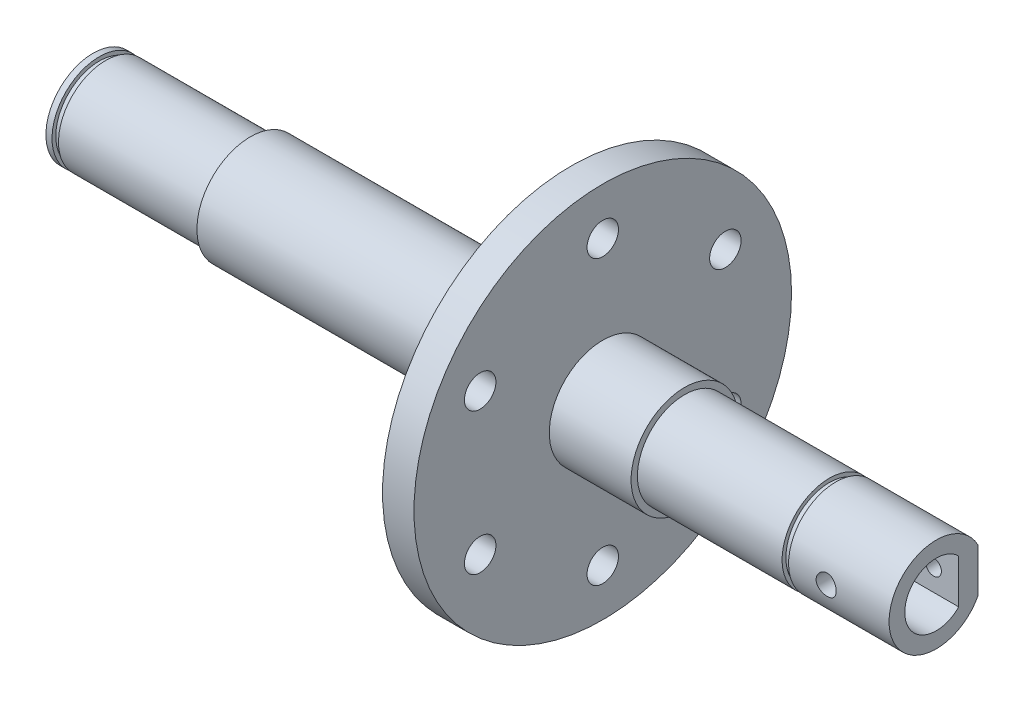
ISO-10303-21;
HEADER;
FILE_DESCRIPTION(('STEP AP214'),'2;1');
FILE_NAME('part.step','',(''),(''),'','','');
FILE_SCHEMA(('AUTOMOTIVE_DESIGN { 1 0 10303 214 1 1 1 1 }'));
ENDSEC;
DATA;
#1=APPLICATION_CONTEXT('core data for automotive mechanical design processes');
#2=APPLICATION_PROTOCOL_DEFINITION('international standard','automotive_design',2000,#1);
#3=PRODUCT_CONTEXT('',#1,'mechanical');
#4=PRODUCT('Part','Part','',(#3));
#5=PRODUCT_RELATED_PRODUCT_CATEGORY('part','',(#4));
#6=PRODUCT_DEFINITION_FORMATION('','',#4);
#7=PRODUCT_DEFINITION_CONTEXT('part definition',#1,'design');
#8=PRODUCT_DEFINITION('design','',#6,#7);
#9=PRODUCT_DEFINITION_SHAPE('','',#8);
#10=(LENGTH_UNIT() NAMED_UNIT(*) SI_UNIT(.MILLI.,.METRE.));
#11=(NAMED_UNIT(*) PLANE_ANGLE_UNIT() SI_UNIT($,.RADIAN.));
#12=(NAMED_UNIT(*) SI_UNIT($,.STERADIAN.) SOLID_ANGLE_UNIT());
#13=UNCERTAINTY_MEASURE_WITH_UNIT(LENGTH_MEASURE(1.E-05),#10,'distance_accuracy_value','');
#14=(GEOMETRIC_REPRESENTATION_CONTEXT(3) GLOBAL_UNCERTAINTY_ASSIGNED_CONTEXT((#13)) GLOBAL_UNIT_ASSIGNED_CONTEXT((#10,
#11,#12)) REPRESENTATION_CONTEXT('',''));
#15=CARTESIAN_POINT('',(0.,0.,0.));
#16=DIRECTION('',(0.,0.,1.));
#17=DIRECTION('',(1.,0.,0.));
#18=AXIS2_PLACEMENT_3D('',#15,#16,#17);
#19=CARTESIAN_POINT('',(0.,0.,0.));
#20=DIRECTION('',(-1.,0.,0.));
#21=DIRECTION('',(0.,0.,-1.));
#22=AXIS2_PLACEMENT_3D('',#19,#20,#21);
#23=CYLINDRICAL_SURFACE('',#22,7.5);
#24=CARTESIAN_POINT('',(94.,0.,0.));
#25=DIRECTION('',(1.,0.,0.));
#26=DIRECTION('',(0.,0.,-1.));
#27=AXIS2_PLACEMENT_3D('',#24,#25,#26);
#28=CIRCLE('',#27,7.5);
#29=CARTESIAN_POINT('',(94.,0.,-7.5));
#30=VERTEX_POINT('',#29);
#31=EDGE_CURVE('E49',#30,#30,#28,.T.);
#32=ORIENTED_EDGE('',*,*,#31,.T.);
#33=EDGE_LOOP('',(#32));
#34=FACE_BOUND('',#33,.T.);
#35=CARTESIAN_POINT('',(117.,0.,0.));
#36=DIRECTION('',(-1.,0.,0.));
#37=DIRECTION('',(0.,1.,0.));
#38=AXIS2_PLACEMENT_3D('',#35,#36,#37);
#39=CIRCLE('',#38,7.5);
#40=CARTESIAN_POINT('',(117.,7.5,0.));
#41=VERTEX_POINT('',#40);
#42=EDGE_CURVE('E576',#41,#41,#39,.T.);
#43=ORIENTED_EDGE('',*,*,#42,.T.);
#44=EDGE_LOOP('',(#43));
#45=FACE_BOUND('',#44,.T.);
#46=ADVANCED_FACE('F41',(#34,#45),#23,.T.);
#47=CARTESIAN_POINT('',(0.,0.,0.));
#48=DIRECTION('',(-1.,0.,0.));
#49=DIRECTION('',(0.,0.,-1.));
#50=AXIS2_PLACEMENT_3D('',#47,#48,#49);
#51=CYLINDRICAL_SURFACE('',#50,7.5);
#52=CARTESIAN_POINT('',(25.,0.,0.));
#53=DIRECTION('',(1.,0.,0.));
#54=DIRECTION('',(0.,0.,-1.));
#55=AXIS2_PLACEMENT_3D('',#52,#53,#54);
#56=CIRCLE('',#55,7.5);
#57=CARTESIAN_POINT('',(25.,0.,-7.5));
#58=VERTEX_POINT('',#57);
#59=EDGE_CURVE('E159',#58,#58,#56,.T.);
#60=ORIENTED_EDGE('',*,*,#59,.F.);
#61=EDGE_LOOP('',(#60));
#62=FACE_BOUND('',#61,.T.);
#63=CARTESIAN_POINT('',(2.,0.,0.));
#64=DIRECTION('',(1.,0.,0.));
#65=DIRECTION('',(0.,-1.,0.));
#66=AXIS2_PLACEMENT_3D('',#63,#64,#65);
#67=CIRCLE('',#66,7.5);
#68=CARTESIAN_POINT('',(2.,-7.5,0.));
#69=VERTEX_POINT('',#68);
#70=EDGE_CURVE('E565',#69,#69,#67,.T.);
#71=ORIENTED_EDGE('',*,*,#70,.T.);
#72=EDGE_LOOP('',(#71));
#73=FACE_BOUND('',#72,.T.);
#74=ADVANCED_FACE('F187',(#62,#73),#51,.T.);
#75=CARTESIAN_POINT('',(94.,8.5,0.));
#76=DIRECTION('',(-1.,0.,0.));
#77=DIRECTION('',(0.,0.,-1.));
#78=AXIS2_PLACEMENT_3D('',#75,#76,#77);
#79=PLANE('',#78);
#80=CARTESIAN_POINT('',(94.,0.,0.));
#81=DIRECTION('',(1.,0.,0.));
#82=DIRECTION('',(0.,0.,-1.));
#83=AXIS2_PLACEMENT_3D('',#80,#81,#82);
#84=CIRCLE('',#83,8.5);
#85=CARTESIAN_POINT('',(94.,0.,-8.5));
#86=VERTEX_POINT('',#85);
#87=EDGE_CURVE('E177',#86,#86,#84,.T.);
#88=ORIENTED_EDGE('',*,*,#87,.T.);
#89=EDGE_LOOP('',(#88));
#90=FACE_BOUND('',#89,.T.);
#91=ORIENTED_EDGE('',*,*,#31,.F.);
#92=EDGE_LOOP('',(#91));
#93=FACE_BOUND('',#92,.T.);
#94=ADVANCED_FACE('F184',(#90,#93),#79,.F.);
#95=CARTESIAN_POINT('',(0.,0.,0.));
#96=DIRECTION('',(-1.,0.,0.));
#97=DIRECTION('',(0.,0.,-1.));
#98=AXIS2_PLACEMENT_3D('',#95,#96,#97);
#99=CYLINDRICAL_SURFACE('',#98,8.5);
#100=CARTESIAN_POINT('',(81.,0.,0.));
#101=DIRECTION('',(1.,0.,0.));
#102=DIRECTION('',(0.,0.,-1.));
#103=AXIS2_PLACEMENT_3D('',#100,#101,#102);
#104=CIRCLE('',#103,8.5);
#105=CARTESIAN_POINT('',(81.,0.,-8.5));
#106=VERTEX_POINT('',#105);
#107=EDGE_CURVE('E174',#106,#106,#104,.T.);
#108=ORIENTED_EDGE('',*,*,#107,.T.);
#109=EDGE_LOOP('',(#108));
#110=FACE_BOUND('',#109,.T.);
#111=ORIENTED_EDGE('',*,*,#87,.F.);
#112=EDGE_LOOP('',(#111));
#113=FACE_BOUND('',#112,.T.);
#114=ADVANCED_FACE('F186',(#110,#113),#99,.T.);
#115=CARTESIAN_POINT('',(81.,8.5,0.));
#116=DIRECTION('',(-1.,0.,0.));
#117=DIRECTION('',(0.,0.,-1.));
#118=AXIS2_PLACEMENT_3D('',#115,#116,#117);
#119=PLANE('',#118);
#120=CARTESIAN_POINT('',(81.,11.2500000000008,-19.4855715851503));
#121=DIRECTION('',(1.,0.,0.));
#122=DIRECTION('',(0.,0.,-1.));
#123=AXIS2_PLACEMENT_3D('',#120,#121,#122);
#124=CIRCLE('',#123,2.50000000000027);
#125=CARTESIAN_POINT('',(81.,11.2500000000008,-21.9855715851506));
#126=VERTEX_POINT('',#125);
#127=EDGE_CURVE('E147',#126,#126,#124,.T.);
#128=ORIENTED_EDGE('',*,*,#127,.F.);
#129=EDGE_LOOP('',(#128));
#130=FACE_BOUND('',#129,.T.);
#131=CARTESIAN_POINT('',(81.,-11.2499999999992,-19.4855715851513));
#132=DIRECTION('',(1.,0.,0.));
#133=DIRECTION('',(0.,0.,-1.));
#134=AXIS2_PLACEMENT_3D('',#131,#132,#133);
#135=CIRCLE('',#134,2.50000000000123);
#136=CARTESIAN_POINT('',(81.,-11.2499999999992,-21.9855715851525));
#137=VERTEX_POINT('',#136);
#138=EDGE_CURVE('E144',#137,#137,#135,.T.);
#139=ORIENTED_EDGE('',*,*,#138,.F.);
#140=EDGE_LOOP('',(#139));
#141=FACE_BOUND('',#140,.T.);
#142=CARTESIAN_POINT('',(81.,-22.5,-1.91295447595611E-12));
#143=DIRECTION('',(1.,0.,0.));
#144=DIRECTION('',(0.,0.,-1.));
#145=AXIS2_PLACEMENT_3D('',#142,#143,#144);
#146=CIRCLE('',#145,2.50000000000198);
#147=CARTESIAN_POINT('',(81.,-22.5,-2.50000000000389));
#148=VERTEX_POINT('',#147);
#149=EDGE_CURVE('E141',#148,#148,#146,.T.);
#150=ORIENTED_EDGE('',*,*,#149,.F.);
#151=EDGE_LOOP('',(#150));
#152=FACE_BOUND('',#151,.T.);
#153=CARTESIAN_POINT('',(81.,-11.2500000000008,19.4855715851484));
#154=DIRECTION('',(1.,0.,0.));
#155=DIRECTION('',(0.,0.,-1.));
#156=AXIS2_PLACEMENT_3D('',#153,#154,#155);
#157=CIRCLE('',#156,2.50000000000183);
#158=CARTESIAN_POINT('',(81.,-11.2500000000008,16.9855715851466));
#159=VERTEX_POINT('',#158);
#160=EDGE_CURVE('E138',#159,#159,#157,.T.);
#161=ORIENTED_EDGE('',*,*,#160,.F.);
#162=EDGE_LOOP('',(#161));
#163=FACE_BOUND('',#162,.T.);
#164=CARTESIAN_POINT('',(81.,11.2499999999992,19.4855715851494));
#165=DIRECTION('',(1.,0.,0.));
#166=DIRECTION('',(0.,0.,-1.));
#167=AXIS2_PLACEMENT_3D('',#164,#165,#166);
#168=CIRCLE('',#167,2.50000000000097);
#169=CARTESIAN_POINT('',(81.,11.2499999999992,16.9855715851484));
#170=VERTEX_POINT('',#169);
#171=EDGE_CURVE('E124',#170,#170,#168,.T.);
#172=ORIENTED_EDGE('',*,*,#171,.F.);
#173=EDGE_LOOP('',(#172));
#174=FACE_BOUND('',#173,.T.);
#175=CARTESIAN_POINT('',(81.,22.5,0.));
#176=DIRECTION('',(1.,0.,0.));
#177=DIRECTION('',(0.,0.,-1.));
#178=AXIS2_PLACEMENT_3D('',#175,#176,#177);
#179=CIRCLE('',#178,2.5);
#180=CARTESIAN_POINT('',(81.,22.5,-2.5));
#181=VERTEX_POINT('',#180);
#182=EDGE_CURVE('E153',#181,#181,#179,.T.);
#183=ORIENTED_EDGE('',*,*,#182,.F.);
#184=EDGE_LOOP('',(#183));
#185=FACE_BOUND('',#184,.T.);
#186=CARTESIAN_POINT('',(81.,0.,0.));
#187=DIRECTION('',(1.,0.,0.));
#188=DIRECTION('',(0.,0.,-1.));
#189=AXIS2_PLACEMENT_3D('',#186,#187,#188);
#190=CIRCLE('',#189,30.);
#191=CARTESIAN_POINT('',(81.,0.,-30.));
#192=VERTEX_POINT('',#191);
#193=EDGE_CURVE('E171',#192,#192,#190,.T.);
#194=ORIENTED_EDGE('',*,*,#193,.T.);
#195=EDGE_LOOP('',(#194));
#196=FACE_BOUND('',#195,.T.);
#197=ORIENTED_EDGE('',*,*,#107,.F.);
#198=EDGE_LOOP('',(#197));
#199=FACE_BOUND('',#198,.T.);
#200=ADVANCED_FACE('F194',(#130,#141,#152,#163,#174,#185,#196,#199),#119,.F.);
#201=CARTESIAN_POINT('',(0.,0.,0.));
#202=DIRECTION('',(-1.,0.,0.));
#203=DIRECTION('',(0.,0.,-1.));
#204=AXIS2_PLACEMENT_3D('',#201,#202,#203);
#205=CYLINDRICAL_SURFACE('',#204,30.);
#206=CARTESIAN_POINT('',(76.,0.,0.));
#207=DIRECTION('',(1.,0.,0.));
#208=DIRECTION('',(0.,0.,-1.));
#209=AXIS2_PLACEMENT_3D('',#206,#207,#208);
#210=CIRCLE('',#209,30.);
#211=CARTESIAN_POINT('',(76.,0.,-30.));
#212=VERTEX_POINT('',#211);
#213=EDGE_CURVE('E168',#212,#212,#210,.T.);
#214=ORIENTED_EDGE('',*,*,#213,.T.);
#215=EDGE_LOOP('',(#214));
#216=FACE_BOUND('',#215,.T.);
#217=ORIENTED_EDGE('',*,*,#193,.F.);
#218=EDGE_LOOP('',(#217));
#219=FACE_BOUND('',#218,.T.);
#220=ADVANCED_FACE('F281',(#216,#219),#205,.T.);
#221=CARTESIAN_POINT('',(76.,30.,0.));
#222=DIRECTION('',(1.,0.,0.));
#223=DIRECTION('',(0.,0.,1.));
#224=AXIS2_PLACEMENT_3D('',#221,#222,#223);
#225=PLANE('',#224);
#226=CARTESIAN_POINT('',(76.,11.2500000000008,-19.4855715851503));
#227=DIRECTION('',(1.,0.,0.));
#228=DIRECTION('',(0.,-1.,0.));
#229=AXIS2_PLACEMENT_3D('',#226,#227,#228);
#230=CIRCLE('',#229,2.50000000000027);
#231=CARTESIAN_POINT('',(76.,8.75000000000056,-19.4855715851503));
#232=VERTEX_POINT('',#231);
#233=EDGE_CURVE('E121',#232,#232,#230,.T.);
#234=ORIENTED_EDGE('',*,*,#233,.T.);
#235=EDGE_LOOP('',(#234));
#236=FACE_BOUND('',#235,.T.);
#237=CARTESIAN_POINT('',(76.,-11.2499999999992,-19.4855715851513));
#238=DIRECTION('',(1.,0.,0.));
#239=DIRECTION('',(0.,-1.,0.));
#240=AXIS2_PLACEMENT_3D('',#237,#238,#239);
#241=CIRCLE('',#240,2.50000000000123);
#242=CARTESIAN_POINT('',(76.,-13.7500000000004,-19.4855715851513));
#243=VERTEX_POINT('',#242);
#244=EDGE_CURVE('E125',#243,#243,#241,.T.);
#245=ORIENTED_EDGE('',*,*,#244,.T.);
#246=EDGE_LOOP('',(#245));
#247=FACE_BOUND('',#246,.T.);
#248=CARTESIAN_POINT('',(76.,-22.5,-1.91295447595611E-12));
#249=DIRECTION('',(1.,0.,0.));
#250=DIRECTION('',(0.,-1.,0.));
#251=AXIS2_PLACEMENT_3D('',#248,#249,#250);
#252=CIRCLE('',#251,2.50000000000198);
#253=CARTESIAN_POINT('',(76.,-25.000000000002,-1.91295447595611E-12));
#254=VERTEX_POINT('',#253);
#255=EDGE_CURVE('E128',#254,#254,#252,.T.);
#256=ORIENTED_EDGE('',*,*,#255,.T.);
#257=EDGE_LOOP('',(#256));
#258=FACE_BOUND('',#257,.T.);
#259=CARTESIAN_POINT('',(76.,-11.2500000000008,19.4855715851484));
#260=DIRECTION('',(1.,0.,0.));
#261=DIRECTION('',(0.,-1.,0.));
#262=AXIS2_PLACEMENT_3D('',#259,#260,#261);
#263=CIRCLE('',#262,2.50000000000183);
#264=CARTESIAN_POINT('',(76.,-13.7500000000027,19.4855715851484));
#265=VERTEX_POINT('',#264);
#266=EDGE_CURVE('E131',#265,#265,#263,.T.);
#267=ORIENTED_EDGE('',*,*,#266,.T.);
#268=EDGE_LOOP('',(#267));
#269=FACE_BOUND('',#268,.T.);
#270=CARTESIAN_POINT('',(76.,11.2499999999992,19.4855715851494));
#271=DIRECTION('',(1.,0.,0.));
#272=DIRECTION('',(0.,-1.,0.));
#273=AXIS2_PLACEMENT_3D('',#270,#271,#272);
#274=CIRCLE('',#273,2.50000000000097);
#275=CARTESIAN_POINT('',(76.,8.74999999999819,19.4855715851494));
#276=VERTEX_POINT('',#275);
#277=EDGE_CURVE('E119',#276,#276,#274,.T.);
#278=ORIENTED_EDGE('',*,*,#277,.T.);
#279=EDGE_LOOP('',(#278));
#280=FACE_BOUND('',#279,.T.);
#281=CARTESIAN_POINT('',(76.,22.5,0.));
#282=DIRECTION('',(1.,0.,0.));
#283=DIRECTION('',(0.,-1.,0.));
#284=AXIS2_PLACEMENT_3D('',#281,#282,#283);
#285=CIRCLE('',#284,2.5);
#286=CARTESIAN_POINT('',(76.,20.,0.));
#287=VERTEX_POINT('',#286);
#288=EDGE_CURVE('E150',#287,#287,#285,.T.);
#289=ORIENTED_EDGE('',*,*,#288,.T.);
#290=EDGE_LOOP('',(#289));
#291=FACE_BOUND('',#290,.T.);
#292=CARTESIAN_POINT('',(76.,0.,0.));
#293=DIRECTION('',(1.,0.,0.));
#294=DIRECTION('',(0.,0.,-1.));
#295=AXIS2_PLACEMENT_3D('',#292,#293,#294);
#296=CIRCLE('',#295,8.5);
#297=CARTESIAN_POINT('',(76.,0.,-8.5));
#298=VERTEX_POINT('',#297);
#299=EDGE_CURVE('E165',#298,#298,#296,.T.);
#300=ORIENTED_EDGE('',*,*,#299,.T.);
#301=EDGE_LOOP('',(#300));
#302=FACE_BOUND('',#301,.T.);
#303=ORIENTED_EDGE('',*,*,#213,.F.);
#304=EDGE_LOOP('',(#303));
#305=FACE_BOUND('',#304,.T.);
#306=ADVANCED_FACE('F277',(#236,#247,#258,#269,#280,#291,#302,#305),#225,.F.);
#307=CARTESIAN_POINT('',(0.,0.,0.));
#308=DIRECTION('',(-1.,0.,0.));
#309=DIRECTION('',(0.,0.,-1.));
#310=AXIS2_PLACEMENT_3D('',#307,#308,#309);
#311=CYLINDRICAL_SURFACE('',#310,8.5);
#312=CARTESIAN_POINT('',(25.,0.,0.));
#313=DIRECTION('',(1.,0.,0.));
#314=DIRECTION('',(0.,0.,-1.));
#315=AXIS2_PLACEMENT_3D('',#312,#313,#314);
#316=CIRCLE('',#315,8.49999999999999);
#317=CARTESIAN_POINT('',(25.,0.,-8.49999999999999));
#318=VERTEX_POINT('',#317);
#319=EDGE_CURVE('E162',#318,#318,#316,.T.);
#320=ORIENTED_EDGE('',*,*,#319,.T.);
#321=EDGE_LOOP('',(#320));
#322=FACE_BOUND('',#321,.T.);
#323=ORIENTED_EDGE('',*,*,#299,.F.);
#324=EDGE_LOOP('',(#323));
#325=FACE_BOUND('',#324,.T.);
#326=ADVANCED_FACE('F273',(#322,#325),#311,.T.);
#327=CARTESIAN_POINT('',(25.,8.49999999999999,0.));
#328=DIRECTION('',(1.,0.,0.));
#329=DIRECTION('',(0.,0.,1.));
#330=AXIS2_PLACEMENT_3D('',#327,#328,#329);
#331=PLANE('',#330);
#332=ORIENTED_EDGE('',*,*,#59,.T.);
#333=EDGE_LOOP('',(#332));
#334=FACE_BOUND('',#333,.T.);
#335=ORIENTED_EDGE('',*,*,#319,.F.);
#336=EDGE_LOOP('',(#335));
#337=FACE_BOUND('',#336,.T.);
#338=ADVANCED_FACE('F265',(#334,#337),#331,.F.);
#339=CARTESIAN_POINT('',(134.,22.5,0.));
#340=DIRECTION('',(-1.,0.,0.));
#341=DIRECTION('',(0.,-1.,0.));
#342=AXIS2_PLACEMENT_3D('',#339,#340,#341);
#343=CYLINDRICAL_SURFACE('',#342,2.5);
#344=ORIENTED_EDGE('',*,*,#288,.F.);
#345=EDGE_LOOP('',(#344));
#346=FACE_BOUND('',#345,.T.);
#347=ORIENTED_EDGE('',*,*,#182,.T.);
#348=EDGE_LOOP('',(#347));
#349=FACE_BOUND('',#348,.T.);
#350=ADVANCED_FACE('F262',(#346,#349),#343,.F.);
#351=CARTESIAN_POINT('',(134.,11.2499999999992,19.4855715851494));
#352=DIRECTION('',(-1.,0.,0.));
#353=DIRECTION('',(0.,-1.,0.));
#354=AXIS2_PLACEMENT_3D('',#351,#352,#353);
#355=CYLINDRICAL_SURFACE('',#354,2.50000000000097);
#356=ORIENTED_EDGE('',*,*,#277,.F.);
#357=EDGE_LOOP('',(#356));
#358=FACE_BOUND('',#357,.T.);
#359=ORIENTED_EDGE('',*,*,#171,.T.);
#360=EDGE_LOOP('',(#359));
#361=FACE_BOUND('',#360,.T.);
#362=ADVANCED_FACE('F258',(#358,#361),#355,.F.);
#363=CARTESIAN_POINT('',(134.,-11.2500000000008,19.4855715851484));
#364=DIRECTION('',(-1.,0.,0.));
#365=DIRECTION('',(0.,-1.,0.));
#366=AXIS2_PLACEMENT_3D('',#363,#364,#365);
#367=CYLINDRICAL_SURFACE('',#366,2.50000000000183);
#368=ORIENTED_EDGE('',*,*,#266,.F.);
#369=EDGE_LOOP('',(#368));
#370=FACE_BOUND('',#369,.T.);
#371=ORIENTED_EDGE('',*,*,#160,.T.);
#372=EDGE_LOOP('',(#371));
#373=FACE_BOUND('',#372,.T.);
#374=ADVANCED_FACE('F254',(#370,#373),#367,.F.);
#375=CARTESIAN_POINT('',(134.,-22.5,-1.91295447595611E-12));
#376=DIRECTION('',(-1.,0.,0.));
#377=DIRECTION('',(0.,-1.,0.));
#378=AXIS2_PLACEMENT_3D('',#375,#376,#377);
#379=CYLINDRICAL_SURFACE('',#378,2.50000000000198);
#380=ORIENTED_EDGE('',*,*,#255,.F.);
#381=EDGE_LOOP('',(#380));
#382=FACE_BOUND('',#381,.T.);
#383=ORIENTED_EDGE('',*,*,#149,.T.);
#384=EDGE_LOOP('',(#383));
#385=FACE_BOUND('',#384,.T.);
#386=ADVANCED_FACE('F250',(#382,#385),#379,.F.);
#387=CARTESIAN_POINT('',(134.,-11.2499999999992,-19.4855715851513));
#388=DIRECTION('',(-1.,0.,0.));
#389=DIRECTION('',(0.,-1.,0.));
#390=AXIS2_PLACEMENT_3D('',#387,#388,#389);
#391=CYLINDRICAL_SURFACE('',#390,2.50000000000123);
#392=ORIENTED_EDGE('',*,*,#244,.F.);
#393=EDGE_LOOP('',(#392));
#394=FACE_BOUND('',#393,.T.);
#395=ORIENTED_EDGE('',*,*,#138,.T.);
#396=EDGE_LOOP('',(#395));
#397=FACE_BOUND('',#396,.T.);
#398=ADVANCED_FACE('F246',(#394,#397),#391,.F.);
#399=CARTESIAN_POINT('',(134.,11.2500000000008,-19.4855715851503));
#400=DIRECTION('',(-1.,0.,0.));
#401=DIRECTION('',(0.,-1.,0.));
#402=AXIS2_PLACEMENT_3D('',#399,#400,#401);
#403=CYLINDRICAL_SURFACE('',#402,2.50000000000027);
#404=ORIENTED_EDGE('',*,*,#233,.F.);
#405=EDGE_LOOP('',(#404));
#406=FACE_BOUND('',#405,.T.);
#407=ORIENTED_EDGE('',*,*,#127,.T.);
#408=EDGE_LOOP('',(#407));
#409=FACE_BOUND('',#408,.T.);
#410=ADVANCED_FACE('F242',(#406,#409),#403,.F.);
#411=CARTESIAN_POINT('',(0.97,0.,0.));
#412=DIRECTION('',(-1.,0.,0.));
#413=DIRECTION('',(0.,-1.,0.));
#414=AXIS2_PLACEMENT_3D('',#411,#412,#413);
#415=PLANE('',#414);
#416=CARTESIAN_POINT('',(0.97,0.,0.));
#417=DIRECTION('',(1.,0.,0.));
#418=DIRECTION('',(0.,-1.,0.));
#419=AXIS2_PLACEMENT_3D('',#416,#417,#418);
#420=CIRCLE('',#419,7.5);
#421=CARTESIAN_POINT('',(0.97,-7.5,0.));
#422=VERTEX_POINT('',#421);
#423=EDGE_CURVE('E564',#422,#422,#420,.T.);
#424=ORIENTED_EDGE('',*,*,#423,.T.);
#425=EDGE_LOOP('',(#424));
#426=FACE_BOUND('',#425,.T.);
#427=CARTESIAN_POINT('',(0.97,0.,0.));
#428=DIRECTION('',(1.,0.,0.));
#429=DIRECTION('',(0.,-1.,0.));
#430=AXIS2_PLACEMENT_3D('',#427,#428,#429);
#431=CIRCLE('',#430,6.9);
#432=CARTESIAN_POINT('',(0.97,-6.9,0.));
#433=VERTEX_POINT('',#432);
#434=EDGE_CURVE('E568',#433,#433,#431,.T.);
#435=ORIENTED_EDGE('',*,*,#434,.F.);
#436=EDGE_LOOP('',(#435));
#437=FACE_BOUND('',#436,.T.);
#438=ADVANCED_FACE('F245',(#426,#437),#415,.F.);
#439=CARTESIAN_POINT('',(2.,0.,0.));
#440=DIRECTION('',(-1.,0.,0.));
#441=DIRECTION('',(0.,-1.,0.));
#442=AXIS2_PLACEMENT_3D('',#439,#440,#441);
#443=PLANE('',#442);
#444=ORIENTED_EDGE('',*,*,#70,.F.);
#445=EDGE_LOOP('',(#444));
#446=FACE_BOUND('',#445,.T.);
#447=CARTESIAN_POINT('',(2.,0.,0.));
#448=DIRECTION('',(1.,0.,0.));
#449=DIRECTION('',(0.,-1.,0.));
#450=AXIS2_PLACEMENT_3D('',#447,#448,#449);
#451=CIRCLE('',#450,6.9);
#452=CARTESIAN_POINT('',(2.,-6.9,0.));
#453=VERTEX_POINT('',#452);
#454=EDGE_CURVE('E571',#453,#453,#451,.T.);
#455=ORIENTED_EDGE('',*,*,#454,.T.);
#456=EDGE_LOOP('',(#455));
#457=FACE_BOUND('',#456,.T.);
#458=ADVANCED_FACE('F362',(#446,#457),#443,.T.);
#459=CARTESIAN_POINT('',(0.97,0.,0.));
#460=DIRECTION('',(1.,0.,0.));
#461=DIRECTION('',(0.,1.,0.));
#462=AXIS2_PLACEMENT_3D('',#459,#460,#461);
#463=CYLINDRICAL_SURFACE('',#462,6.9);
#464=ORIENTED_EDGE('',*,*,#434,.T.);
#465=EDGE_LOOP('',(#464));
#466=FACE_BOUND('',#465,.T.);
#467=ORIENTED_EDGE('',*,*,#454,.F.);
#468=EDGE_LOOP('',(#467));
#469=FACE_BOUND('',#468,.T.);
#470=ADVANCED_FACE('F370',(#466,#469),#463,.T.);
#471=CARTESIAN_POINT('',(0.,7.5,0.));
#472=DIRECTION('',(1.,0.,0.));
#473=DIRECTION('',(0.,0.,1.));
#474=AXIS2_PLACEMENT_3D('',#471,#472,#473);
#475=PLANE('',#474);
#476=CARTESIAN_POINT('',(0.,0.,0.));
#477=DIRECTION('',(1.,0.,0.));
#478=DIRECTION('',(0.,0.,-1.));
#479=AXIS2_PLACEMENT_3D('',#476,#477,#478);
#480=CIRCLE('',#479,7.5);
#481=CARTESIAN_POINT('',(0.,0.,-7.5));
#482=VERTEX_POINT('',#481);
#483=EDGE_CURVE('E156',#482,#482,#480,.T.);
#484=ORIENTED_EDGE('',*,*,#483,.F.);
#485=EDGE_LOOP('',(#484));
#486=FACE_BOUND('',#485,.T.);
#487=ADVANCED_FACE('F43',(#486),#475,.F.);
#488=ORIENTED_EDGE('',*,*,#423,.F.);
#489=EDGE_LOOP('',(#488));
#490=FACE_BOUND('',#489,.T.);
#491=ORIENTED_EDGE('',*,*,#483,.T.);
#492=EDGE_LOOP('',(#491));
#493=FACE_BOUND('',#492,.T.);
#494=ADVANCED_FACE('F199',(#490,#493),#51,.T.);
#495=CARTESIAN_POINT('',(118.03,0.,0.));
#496=DIRECTION('',(1.,0.,0.));
#497=DIRECTION('',(0.,1.,0.));
#498=AXIS2_PLACEMENT_3D('',#495,#496,#497);
#499=PLANE('',#498);
#500=CARTESIAN_POINT('',(118.03,0.,0.));
#501=DIRECTION('',(-1.,0.,0.));
#502=DIRECTION('',(0.,1.,0.));
#503=AXIS2_PLACEMENT_3D('',#500,#501,#502);
#504=CIRCLE('',#503,7.5);
#505=CARTESIAN_POINT('',(118.03,7.5,0.));
#506=VERTEX_POINT('',#505);
#507=EDGE_CURVE('E216',#506,#506,#504,.T.);
#508=ORIENTED_EDGE('',*,*,#507,.T.);
#509=EDGE_LOOP('',(#508));
#510=FACE_BOUND('',#509,.T.);
#511=CARTESIAN_POINT('',(118.03,0.,0.));
#512=DIRECTION('',(-1.,0.,0.));
#513=DIRECTION('',(0.,1.,0.));
#514=AXIS2_PLACEMENT_3D('',#511,#512,#513);
#515=CIRCLE('',#514,6.9);
#516=CARTESIAN_POINT('',(118.03,6.9,0.));
#517=VERTEX_POINT('',#516);
#518=EDGE_CURVE('E579',#517,#517,#515,.T.);
#519=ORIENTED_EDGE('',*,*,#518,.F.);
#520=EDGE_LOOP('',(#519));
#521=FACE_BOUND('',#520,.T.);
#522=ADVANCED_FACE('F269',(#510,#521),#499,.F.);
#523=CARTESIAN_POINT('',(117.,0.,0.));
#524=DIRECTION('',(1.,0.,0.));
#525=DIRECTION('',(0.,1.,0.));
#526=AXIS2_PLACEMENT_3D('',#523,#524,#525);
#527=PLANE('',#526);
#528=ORIENTED_EDGE('',*,*,#42,.F.);
#529=EDGE_LOOP('',(#528));
#530=FACE_BOUND('',#529,.T.);
#531=CARTESIAN_POINT('',(117.,0.,0.));
#532=DIRECTION('',(-1.,0.,0.));
#533=DIRECTION('',(0.,1.,0.));
#534=AXIS2_PLACEMENT_3D('',#531,#532,#533);
#535=CIRCLE('',#534,6.9);
#536=CARTESIAN_POINT('',(117.,6.9,0.));
#537=VERTEX_POINT('',#536);
#538=EDGE_CURVE('E581',#537,#537,#535,.T.);
#539=ORIENTED_EDGE('',*,*,#538,.T.);
#540=EDGE_LOOP('',(#539));
#541=FACE_BOUND('',#540,.T.);
#542=ADVANCED_FACE('F395',(#530,#541),#527,.T.);
#543=CARTESIAN_POINT('',(118.03,0.,0.));
#544=DIRECTION('',(-1.,0.,0.));
#545=DIRECTION('',(0.,-1.,0.));
#546=AXIS2_PLACEMENT_3D('',#543,#544,#545);
#547=CYLINDRICAL_SURFACE('',#546,6.9);
#548=ORIENTED_EDGE('',*,*,#518,.T.);
#549=EDGE_LOOP('',(#548));
#550=FACE_BOUND('',#549,.T.);
#551=ORIENTED_EDGE('',*,*,#538,.F.);
#552=EDGE_LOOP('',(#551));
#553=FACE_BOUND('',#552,.T.);
#554=ADVANCED_FACE('F403',(#550,#553),#547,.T.);
#555=CARTESIAN_POINT('',(120.,0.,0.));
#556=DIRECTION('',(1.,0.,0.));
#557=DIRECTION('',(0.,1.,0.));
#558=AXIS2_PLACEMENT_3D('',#555,#556,#557);
#559=PLANE('',#558);
#560=CARTESIAN_POINT('',(120.,0.,0.));
#561=DIRECTION('',(-1.,0.,0.));
#562=DIRECTION('',(0.,1.,0.));
#563=AXIS2_PLACEMENT_3D('',#560,#561,#562);
#564=CIRCLE('',#563,5.);
#565=CARTESIAN_POINT('',(120.,-3.5,-3.57071421427143));
#566=VERTEX_POINT('',#565);
#567=CARTESIAN_POINT('',(120.,3.5,-3.57071421427143));
#568=VERTEX_POINT('',#567);
#569=EDGE_CURVE('E106',#566,#568,#564,.T.);
#570=ORIENTED_EDGE('',*,*,#569,.F.);
#571=DIRECTION('',(0.,-1.,0.));
#572=VECTOR('',#571,1.);
#573=CARTESIAN_POINT('',(120.,3.5,-3.57071421427143));
#574=LINE('',#573,#572);
#575=EDGE_CURVE('E109',#568,#566,#574,.T.);
#576=ORIENTED_EDGE('',*,*,#575,.F.);
#577=EDGE_LOOP('',(#570,#576));
#578=FACE_BOUND('',#577,.T.);
#579=ADVANCED_FACE('F411',(#578),#559,.T.);
#580=CARTESIAN_POINT('',(124.,0.,30.));
#581=DIRECTION('',(0.,0.,-1.));
#582=DIRECTION('',(1.,0.,0.));
#583=AXIS2_PLACEMENT_3D('',#580,#581,#582);
#584=CYLINDRICAL_SURFACE('',#583,1.60000000000002);
#585=CARTESIAN_POINT('',(124.,0.,-6.6332495807108));
#586=DIRECTION('',(0.,0.,1.));
#587=DIRECTION('',(1.,0.,0.));
#588=AXIS2_PLACEMENT_3D('',#585,#586,#587);
#589=CIRCLE('',#588,1.60000000000002);
#590=CARTESIAN_POINT('',(125.6,0.,-6.6332495807108));
#591=VERTEX_POINT('',#590);
#592=EDGE_CURVE('E225',#591,#591,#589,.T.);
#593=ORIENTED_EDGE('',*,*,#592,.F.);
#594=EDGE_LOOP('',(#593));
#595=FACE_BOUND('',#594,.T.);
#596=CARTESIAN_POINT('',(124.,0.,-3.57071421427142));
#597=DIRECTION('',(0.,0.,1.));
#598=DIRECTION('',(1.,0.,0.));
#599=AXIS2_PLACEMENT_3D('',#596,#597,#598);
#600=CIRCLE('',#599,1.60000000000002);
#601=CARTESIAN_POINT('',(125.6,0.,-3.57071421427142));
#602=VERTEX_POINT('',#601);
#603=EDGE_CURVE('E222',#602,#602,#600,.T.);
#604=ORIENTED_EDGE('',*,*,#603,.T.);
#605=EDGE_LOOP('',(#604));
#606=FACE_BOUND('',#605,.T.);
#607=ADVANCED_FACE('F212',(#595,#606),#584,.F.);
#608=CARTESIAN_POINT('',(130.,0.,-6.6332495807108));
#609=DIRECTION('',(0.,0.,-1.));
#610=DIRECTION('',(1.,0.,0.));
#611=AXIS2_PLACEMENT_3D('',#608,#609,#610);
#612=CYLINDRICAL_SURFACE('',#611,1.25);
#613=CARTESIAN_POINT('',(130.,0.,-6.6332495807108));
#614=DIRECTION('',(0.,0.,1.));
#615=DIRECTION('',(1.,0.,0.));
#616=AXIS2_PLACEMENT_3D('',#613,#614,#615);
#617=CIRCLE('',#616,1.25);
#618=CARTESIAN_POINT('',(131.25,0.,-6.6332495807108));
#619=VERTEX_POINT('',#618);
#620=EDGE_CURVE('E556',#619,#619,#617,.T.);
#621=ORIENTED_EDGE('',*,*,#620,.F.);
#622=EDGE_LOOP('',(#621));
#623=FACE_BOUND('',#622,.T.);
#624=CARTESIAN_POINT('',(130.,0.,-3.57071421427143));
#625=DIRECTION('',(0.,0.,1.));
#626=DIRECTION('',(1.,0.,0.));
#627=AXIS2_PLACEMENT_3D('',#624,#625,#626);
#628=CIRCLE('',#627,1.25);
#629=CARTESIAN_POINT('',(131.25,0.,-3.57071421427143));
#630=VERTEX_POINT('',#629);
#631=EDGE_CURVE('E559',#630,#630,#628,.T.);
#632=ORIENTED_EDGE('',*,*,#631,.T.);
#633=EDGE_LOOP('',(#632));
#634=FACE_BOUND('',#633,.T.);
#635=ADVANCED_FACE('F425',(#623,#634),#612,.F.);
#636=CARTESIAN_POINT('',(120.,3.5,-3.57071421427143));
#637=DIRECTION('',(0.,0.,-1.));
#638=DIRECTION('',(1.,0.,0.));
#639=AXIS2_PLACEMENT_3D('',#636,#637,#638);
#640=PLANE('',#639);
#641=ORIENTED_EDGE('',*,*,#631,.F.);
#642=EDGE_LOOP('',(#641));
#643=FACE_BOUND('',#642,.T.);
#644=ORIENTED_EDGE('',*,*,#603,.F.);
#645=EDGE_LOOP('',(#644));
#646=FACE_BOUND('',#645,.T.);
#647=DIRECTION('',(0.,-1.,0.));
#648=VECTOR('',#647,1.);
#649=CARTESIAN_POINT('',(134.,3.5,-3.57071421427143));
#650=LINE('',#649,#648);
#651=CARTESIAN_POINT('',(134.,3.5,-3.57071421427143));
#652=VERTEX_POINT('',#651);
#653=CARTESIAN_POINT('',(134.,-3.5,-3.57071421427143));
#654=VERTEX_POINT('',#653);
#655=EDGE_CURVE('E110',#652,#654,#650,.T.);
#656=ORIENTED_EDGE('',*,*,#655,.F.);
#657=DIRECTION('',(1.,0.,0.));
#658=VECTOR('',#657,1.);
#659=CARTESIAN_POINT('',(120.,3.5,-3.57071421427143));
#660=LINE('',#659,#658);
#661=EDGE_CURVE('E113',#568,#652,#660,.T.);
#662=ORIENTED_EDGE('',*,*,#661,.F.);
#663=ORIENTED_EDGE('',*,*,#575,.T.);
#664=DIRECTION('',(1.,0.,0.));
#665=VECTOR('',#664,1.);
#666=CARTESIAN_POINT('',(120.,-3.5,-3.57071421427143));
#667=LINE('',#666,#665);
#668=EDGE_CURVE('E116',#566,#654,#667,.T.);
#669=ORIENTED_EDGE('',*,*,#668,.T.);
#670=EDGE_LOOP('',(#656,#662,#663,#669));
#671=FACE_BOUND('',#670,.T.);
#672=ADVANCED_FACE('F239',(#643,#646,#671),#640,.F.);
#673=CARTESIAN_POINT('',(120.,0.,0.));
#674=DIRECTION('',(1.,0.,0.));
#675=DIRECTION('',(0.,1.,0.));
#676=AXIS2_PLACEMENT_3D('',#673,#674,#675);
#677=CYLINDRICAL_SURFACE('',#676,5.);
#678=CARTESIAN_POINT('',(125.6,0.,5.));
#679=CARTESIAN_POINT('',(125.599999756349,-0.0874958063159813,4.99999978543627));
#680=CARTESIAN_POINT('',(125.592799404721,-0.174994637059064,4.99768184156355));
#681=CARTESIAN_POINT('',(125.564268180471,-0.347426901237488,4.98866262172227));
#682=CARTESIAN_POINT('',(125.542934728182,-0.432359863373714,4.98196054553558));
#683=CARTESIAN_POINT('',(125.486935078788,-0.597149225791573,4.9649038363541));
#684=CARTESIAN_POINT('',(125.452290107629,-0.677013473384605,4.95455502045191));
#685=CARTESIAN_POINT('',(125.370743169913,-0.829798762851168,4.93126901642872));
#686=CARTESIAN_POINT('',(125.323839094234,-0.902718607024957,4.91833138300385));
#687=CARTESIAN_POINT('',(125.217515886496,-1.041894757795,4.89077067933825));
#688=CARTESIAN_POINT('',(125.157772901047,-1.10789609224642,4.87610957732917));
#689=CARTESIAN_POINT('',(125.028156933453,-1.2291342369323,4.8469706570307));
#690=CARTESIAN_POINT('',(124.958281952345,-1.28436891793799,4.83249287552328));
#691=CARTESIAN_POINT('',(124.80814714549,-1.38391395073833,4.80494810799029));
#692=CARTESIAN_POINT('',(124.727663718729,-1.42790123109946,4.79192785635416));
#693=CARTESIAN_POINT('',(124.55995765623,-1.50160917134592,4.76934657798645));
#694=CARTESIAN_POINT('',(124.472736902012,-1.53133379773328,4.75978458968015));
#695=CARTESIAN_POINT('',(124.296917392727,-1.57473134311323,4.74560122760596));
#696=CARTESIAN_POINT('',(124.208447898248,-1.58887896846388,4.74083414932744));
#697=CARTESIAN_POINT('',(124.030272400816,-1.60220433058853,4.73634831044999));
#698=CARTESIAN_POINT('',(123.940566752148,-1.60138627093722,4.73662813227305));
#699=CARTESIAN_POINT('',(123.766434415112,-1.58517380736383,4.74207619100074));
#700=CARTESIAN_POINT('',(123.681943546555,-1.57038842132727,4.74704017430419));
#701=CARTESIAN_POINT('',(123.516711155578,-1.52765058974141,4.76096457446161));
#702=CARTESIAN_POINT('',(123.435970050415,-1.49969668269329,4.76992543490024));
#703=CARTESIAN_POINT('',(123.279102141174,-1.43099645158814,4.79098654163639));
#704=CARTESIAN_POINT('',(123.203063780049,-1.39006273103724,4.80313229469362));
#705=CARTESIAN_POINT('',(123.058737956973,-1.29669494334069,4.82917444861167));
#706=CARTESIAN_POINT('',(122.990452597256,-1.24425776827157,4.8430713221454));
#707=CARTESIAN_POINT('',(122.860135327134,-1.12640551540389,4.87186372141871));
#708=CARTESIAN_POINT('',(122.798559223061,-1.06048936249404,4.8867752080818));
#709=CARTESIAN_POINT('',(122.687221321766,-0.919081432217165,4.91533168114877));
#710=CARTESIAN_POINT('',(122.637460486857,-0.843588875652712,4.92897656433706));
#711=CARTESIAN_POINT('',(122.55083655672,-0.68426158071239,4.95361789744584));
#712=CARTESIAN_POINT('',(122.514086899164,-0.600361279440649,4.96459080547942));
#713=CARTESIAN_POINT('',(122.455360403337,-0.427135850361139,4.98248161100196));
#714=CARTESIAN_POINT('',(122.433378852183,-0.337812463131553,4.98940080204637));
#715=CARTESIAN_POINT('',(122.405599933335,-0.16014178958932,4.99819424239135));
#716=CARTESIAN_POINT('',(122.399185926389,-0.0719002860170746,5.00026060178154));
#717=CARTESIAN_POINT('',(122.400979218221,0.104410269588107,4.99968655318444));
#718=CARTESIAN_POINT('',(122.40918426531,0.192479346087442,4.99704687004206));
#719=CARTESIAN_POINT('',(122.439490113081,0.363535018203817,4.98748380317497));
#720=CARTESIAN_POINT('',(122.461219910086,0.446594362478029,4.98067486649266));
#721=CARTESIAN_POINT('',(122.517501799396,0.60786165460059,4.96357585995349));
#722=CARTESIAN_POINT('',(122.552055496602,0.686068993794134,4.95328535439546));
#723=CARTESIAN_POINT('',(122.633971017178,0.837596923870455,4.92995531019905));
#724=CARTESIAN_POINT('',(122.681632511942,0.910745620500976,4.9168532627009));
#725=CARTESIAN_POINT('',(122.788053872986,1.04821150300663,4.8893940824048));
#726=CARTESIAN_POINT('',(122.846816886458,1.112526175554,4.87503659432078));
#727=CARTESIAN_POINT('',(122.976674159611,1.23328321488637,4.84592967283237));
#728=CARTESIAN_POINT('',(123.048180267688,1.28928579475622,4.83118884166734));
#729=CARTESIAN_POINT('',(123.199894674458,1.38854141992571,4.80360443110144));
#730=CARTESIAN_POINT('',(123.280102901454,1.43179457025643,4.79076083607138));
#731=CARTESIAN_POINT('',(123.446843578656,1.50407580301233,4.76856262886575));
#732=CARTESIAN_POINT('',(123.53335413499,1.53315066307448,4.75919656820051));
#733=CARTESIAN_POINT('',(123.71040720981,1.57620668246203,4.74511281699327));
#734=CARTESIAN_POINT('',(123.800948081136,1.59019395006569,4.74039324536733));
#735=CARTESIAN_POINT('',(123.978875969164,1.60222535311568,4.73633927898767));
#736=CARTESIAN_POINT('',(124.066209011329,1.60099388446008,4.73676019091381));
#737=CARTESIAN_POINT('',(124.239357005435,1.58438355149372,4.74234159093744));
#738=CARTESIAN_POINT('',(124.325172034561,1.56900540861123,4.74750183734631));
#739=CARTESIAN_POINT('',(124.491483425377,1.52503332416463,4.76180543144415));
#740=CARTESIAN_POINT('',(124.572043198893,1.49665627942708,4.77088327236762));
#741=CARTESIAN_POINT('',(124.727321760401,1.42766427484384,4.79197975594361));
#742=CARTESIAN_POINT('',(124.802039315763,1.38704674114627,4.80399901699919));
#743=CARTESIAN_POINT('',(124.946809629814,1.29279266707433,4.83023494368376));
#744=CARTESIAN_POINT('',(125.016548262734,1.23869308431579,4.8445211905268));
#745=CARTESIAN_POINT('',(125.146191745821,1.11981399792886,4.87337180847353));
#746=CARTESIAN_POINT('',(125.206093905199,1.05503158166824,4.88793625446695));
#747=CARTESIAN_POINT('',(125.316458285924,0.913912210298368,4.91631108200117));
#748=CARTESIAN_POINT('',(125.366518951884,0.837251351760798,4.93007751880385));
#749=CARTESIAN_POINT('',(125.452980188097,0.676163529926958,4.9547378769786));
#750=CARTESIAN_POINT('',(125.489385479321,0.591739263208179,4.96563279071293));
#751=CARTESIAN_POINT('',(125.54524777983,0.423663431644866,4.98268341064065));
#752=CARTESIAN_POINT('',(125.565718450583,0.34037676648735,4.9891190130145));
#753=CARTESIAN_POINT('',(125.593093142904,0.171394001076131,4.99777693541394));
#754=CARTESIAN_POINT('',(125.600000238645,0.0856984512614005,5.00000021015613));
#755=CARTESIAN_POINT('',(125.6,0.,5.));
#756=B_SPLINE_CURVE_WITH_KNOTS('',3,(#678,#679,#680,#681,#682,#683,#684,#685,#686,#687,#688,
#689,#690,#691,#692,#693,#694,#695,#696,#697,#698,#699,#700,#701,#702,#703,#704,#705,#706,#707,
#708,#709,#710,#711,#712,#713,#714,#715,#716,#717,#718,#719,#720,#721,#722,#723,#724,#725,#726,
#727,#728,#729,#730,#731,#732,#733,#734,#735,#736,#737,#738,#739,#740,#741,#742,#743,#744,#745,
#746,#747,#748,#749,#750,#751,#752,#753,#754,#755),.UNSPECIFIED.,.T.,.F.,(4,2,2,2,2,2,2,2,2,2,2,
2,2,2,2,2,2,2,2,2,2,2,2,2,2,2,2,2,2,2,2,2,2,2,2,2,2,2,4),(0.,0.26217228986649,0.524392446348371,
0.786196202111721,1.04804502964705,1.3174971815157,1.58700256668428,1.86354828826629,
2.14001705671958,2.40780489999511,2.67551752794227,2.93207089351449,3.18865273918782,
3.44912195934767,3.70966163813013,3.98267284808628,4.25570628624559,4.531064713342,
4.80633522466355,5.07051010591351,5.33464430132706,5.59183416387796,5.8490562243834,
6.11273355055089,6.37648573964826,6.65122993053069,6.92597185797951,7.19980110675114,
7.47351945288805,7.73426134972858,7.99498995043,8.25151822881327,8.50810048600716,
8.77513756675935,9.04224757485595,9.31866285531271,9.5949824844974,9.85182740305359,
10.1086141011963),.UNSPECIFIED.);
#757=CARTESIAN_POINT('',(125.6,0.,5.));
#758=VERTEX_POINT('',#757);
#759=EDGE_CURVE('E220',#758,#758,#756,.T.);
#760=ORIENTED_EDGE('',*,*,#759,.F.);
#761=EDGE_LOOP('',(#760));
#762=FACE_BOUND('',#761,.T.);
#763=CARTESIAN_POINT('',(134.,0.,0.));
#764=DIRECTION('',(-1.,0.,0.));
#765=DIRECTION('',(0.,1.,0.));
#766=AXIS2_PLACEMENT_3D('',#763,#764,#765);
#767=CIRCLE('',#766,5.);
#768=EDGE_CURVE('E63',#654,#652,#767,.T.);
#769=ORIENTED_EDGE('',*,*,#768,.F.);
#770=ORIENTED_EDGE('',*,*,#668,.F.);
#771=ORIENTED_EDGE('',*,*,#569,.T.);
#772=ORIENTED_EDGE('',*,*,#661,.T.);
#773=EDGE_LOOP('',(#769,#770,#771,#772));
#774=FACE_BOUND('',#773,.T.);
#775=ADVANCED_FACE('F234',(#762,#774),#677,.F.);
#776=CARTESIAN_POINT('',(119.,0.,0.));
#777=DIRECTION('',(1.,0.,0.));
#778=DIRECTION('',(0.,1.,0.));
#779=AXIS2_PLACEMENT_3D('',#776,#777,#778);
#780=PLANE('',#779);
#781=CARTESIAN_POINT('',(119.,0.,0.));
#782=DIRECTION('',(-1.,0.,0.));
#783=DIRECTION('',(0.,1.,0.));
#784=AXIS2_PLACEMENT_3D('',#781,#782,#783);
#785=CIRCLE('',#784,7.5);
#786=CARTESIAN_POINT('',(119.,3.5,-6.6332495807108));
#787=VERTEX_POINT('',#786);
#788=CARTESIAN_POINT('',(119.,-3.5,-6.6332495807108));
#789=VERTEX_POINT('',#788);
#790=EDGE_CURVE('E92',#787,#789,#785,.T.);
#791=ORIENTED_EDGE('',*,*,#790,.F.);
#792=DIRECTION('',(0.,1.,0.));
#793=VECTOR('',#792,1.);
#794=CARTESIAN_POINT('',(119.,3.5,-6.6332495807108));
#795=LINE('',#794,#793);
#796=EDGE_CURVE('E85',#789,#787,#795,.T.);
#797=ORIENTED_EDGE('',*,*,#796,.F.);
#798=EDGE_LOOP('',(#791,#797));
#799=FACE_BOUND('',#798,.T.);
#800=ADVANCED_FACE('F91',(#799),#780,.T.);
#801=CARTESIAN_POINT('',(119.,3.5,-6.6332495807108));
#802=DIRECTION('',(0.,0.,1.));
#803=DIRECTION('',(-1.,0.,0.));
#804=AXIS2_PLACEMENT_3D('',#801,#802,#803);
#805=PLANE('',#804);
#806=ORIENTED_EDGE('',*,*,#620,.T.);
#807=EDGE_LOOP('',(#806));
#808=FACE_BOUND('',#807,.T.);
#809=ORIENTED_EDGE('',*,*,#592,.T.);
#810=EDGE_LOOP('',(#809));
#811=FACE_BOUND('',#810,.T.);
#812=DIRECTION('',(0.,1.,0.));
#813=VECTOR('',#812,1.);
#814=CARTESIAN_POINT('',(134.,3.5,-6.6332495807108));
#815=LINE('',#814,#813);
#816=CARTESIAN_POINT('',(134.,-3.5,-6.6332495807108));
#817=VERTEX_POINT('',#816);
#818=CARTESIAN_POINT('',(134.,3.5,-6.6332495807108));
#819=VERTEX_POINT('',#818);
#820=EDGE_CURVE('E88',#817,#819,#815,.T.);
#821=ORIENTED_EDGE('',*,*,#820,.F.);
#822=DIRECTION('',(1.,0.,0.));
#823=VECTOR('',#822,1.);
#824=CARTESIAN_POINT('',(119.,-3.5,-6.6332495807108));
#825=LINE('',#824,#823);
#826=EDGE_CURVE('E82',#789,#817,#825,.T.);
#827=ORIENTED_EDGE('',*,*,#826,.F.);
#828=ORIENTED_EDGE('',*,*,#796,.T.);
#829=DIRECTION('',(1.,0.,0.));
#830=VECTOR('',#829,1.);
#831=CARTESIAN_POINT('',(119.,3.5,-6.6332495807108));
#832=LINE('',#831,#830);
#833=EDGE_CURVE('E56',#787,#819,#832,.T.);
#834=ORIENTED_EDGE('',*,*,#833,.T.);
#835=EDGE_LOOP('',(#821,#827,#828,#834));
#836=FACE_BOUND('',#835,.T.);
#837=ADVANCED_FACE('F84',(#808,#811,#836),#805,.F.);
#838=CARTESIAN_POINT('',(134.,7.5,0.));
#839=DIRECTION('',(-1.,0.,0.));
#840=DIRECTION('',(0.,0.,-1.));
#841=AXIS2_PLACEMENT_3D('',#838,#839,#840);
#842=PLANE('',#841);
#843=ORIENTED_EDGE('',*,*,#655,.T.);
#844=ORIENTED_EDGE('',*,*,#768,.T.);
#845=EDGE_LOOP('',(#843,#844));
#846=FACE_BOUND('',#845,.T.);
#847=CARTESIAN_POINT('',(134.,0.,0.));
#848=DIRECTION('',(1.,0.,0.));
#849=DIRECTION('',(0.,0.,-1.));
#850=AXIS2_PLACEMENT_3D('',#847,#848,#849);
#851=CIRCLE('',#850,7.5);
#852=EDGE_CURVE('E11',#819,#817,#851,.T.);
#853=ORIENTED_EDGE('',*,*,#852,.T.);
#854=ORIENTED_EDGE('',*,*,#820,.T.);
#855=EDGE_LOOP('',(#853,#854));
#856=FACE_BOUND('',#855,.T.);
#857=ADVANCED_FACE('F210',(#846,#856),#842,.F.);
#858=ORIENTED_EDGE('',*,*,#759,.T.);
#859=EDGE_LOOP('',(#858));
#860=FACE_BOUND('',#859,.T.);
#861=CARTESIAN_POINT('',(125.6,0.,7.5));
#862=CARTESIAN_POINT('',(125.599996894195,0.0887944293338568,7.4999983570598));
#863=CARTESIAN_POINT('',(125.59258336552,0.177626889700684,7.49840703800838));
#864=CARTESIAN_POINT('',(125.563153761428,0.352772204992279,7.49221258982039));
#865=CARTESIAN_POINT('',(125.541126905423,0.439083150622774,7.48760723719598));
#866=CARTESIAN_POINT('',(125.483189048046,0.606628580180672,7.47589793294748));
#867=CARTESIAN_POINT('',(125.447292194879,0.687868139445277,7.46879652810656));
#868=CARTESIAN_POINT('',(125.362677392397,0.843167757727088,7.45286320133508));
#869=CARTESIAN_POINT('',(125.313959901663,0.917228073407933,7.4440313413038));
#870=CARTESIAN_POINT('',(125.204297169535,1.0572041936893,7.42545480782522));
#871=CARTESIAN_POINT('',(125.143193366897,1.12299434543088,7.41569927510424));
#872=CARTESIAN_POINT('',(125.010833063914,1.24347351522625,7.39645215099327));
#873=CARTESIAN_POINT('',(124.939575693798,1.29816158128344,7.38696058229821));
#874=CARTESIAN_POINT('',(124.78800940494,1.39543277767188,7.36920930951561));
#875=CARTESIAN_POINT('',(124.707613556684,1.43788322502764,7.36096353805546));
#876=CARTESIAN_POINT('',(124.540624683101,1.50862340101054,7.34679287525928));
#877=CARTESIAN_POINT('',(124.454032361403,1.53691473453876,7.34086772090353));
#878=CARTESIAN_POINT('',(124.27846838089,1.57812049535872,7.33211955105285));
#879=CARTESIAN_POINT('',(124.189551074592,1.59125680705958,7.32925182047022));
#880=CARTESIAN_POINT('',(124.010731955849,1.60246934089931,7.32680881403604));
#881=CARTESIAN_POINT('',(123.920830259553,1.60054732105776,7.32723315384411));
#882=CARTESIAN_POINT('',(123.744236044483,1.58187655808687,7.33128581769295));
#883=CARTESIAN_POINT('',(123.657514915888,1.56538455643808,7.33485865843676));
#884=CARTESIAN_POINT('',(123.488099348302,1.51844828834835,7.34471814062501));
#885=CARTESIAN_POINT('',(123.405405125583,1.48800327344865,7.35100492764819));
#886=CARTESIAN_POINT('',(123.24566362656,1.41378668233805,7.36563922179753));
#887=CARTESIAN_POINT('',(123.168664095209,1.36991548636569,7.37400204199821));
#888=CARTESIAN_POINT('',(123.023024286771,1.27016199217253,7.39183660364212));
#889=CARTESIAN_POINT('',(122.954385098255,1.21427813244003,7.40130848917848));
#890=CARTESIAN_POINT('',(122.825935246082,1.09072196751543,7.4205326849195));
#891=CARTESIAN_POINT('',(122.766334882136,1.02283110172084,7.43028675890513));
#892=CARTESIAN_POINT('',(122.659332586313,0.877908758701813,7.44879883076769));
#893=CARTESIAN_POINT('',(122.611930855024,0.800877131200508,7.45755681226393));
#894=CARTESIAN_POINT('',(122.530623324993,0.639610081827271,7.4731161994162));
#895=CARTESIAN_POINT('',(122.496744037718,0.555360898326555,7.47991375438739));
#896=CARTESIAN_POINT('',(122.443680658796,0.382188547319416,7.49075760800742));
#897=CARTESIAN_POINT('',(122.424494536534,0.293266027489787,7.49480428682212));
#898=CARTESIAN_POINT('',(122.401665569816,0.115076046551735,7.49963667143352));
#899=CARTESIAN_POINT('',(122.397735300314,0.0258469966592072,7.50048267119555));
#900=CARTESIAN_POINT('',(122.404752031212,-0.151992686528005,7.49898689492793));
#901=CARTESIAN_POINT('',(122.415698074166,-0.240603359252853,7.49664532405204));
#902=CARTESIAN_POINT('',(122.451918225216,-0.41374606238026,7.48907546339841));
#903=CARTESIAN_POINT('',(122.477042548525,-0.498310863335308,7.48387736587364));
#904=CARTESIAN_POINT('',(122.54074058388,-0.662026395792991,7.47117587533623));
#905=CARTESIAN_POINT('',(122.579315402538,-0.741176681186487,7.46367229265062));
#906=CARTESIAN_POINT('',(122.669425074618,-0.893011950773014,7.44704294085318));
#907=CARTESIAN_POINT('',(122.721130026515,-0.965593659738493,7.43789638159132));
#908=CARTESIAN_POINT('',(122.83580715603,-1.10115356003049,7.41903990869546));
#909=CARTESIAN_POINT('',(122.898780720812,-1.16413056725133,7.40932992580373));
#910=CARTESIAN_POINT('',(123.035523439628,-1.27982177561403,7.39023419815026));
#911=CARTESIAN_POINT('',(123.109461993408,-1.33233743532726,7.38085708289827));
#912=CARTESIAN_POINT('',(123.265278711512,-1.42420609305474,7.36368318738414));
#913=CARTESIAN_POINT('',(123.347156538371,-1.46355965021718,7.35588633999514));
#914=CARTESIAN_POINT('',(123.516094575057,-1.52772807228233,7.3428278116798));
#915=CARTESIAN_POINT('',(123.60312321577,-1.55262307368946,7.33755218632522));
#916=CARTESIAN_POINT('',(123.78025472588,-1.58740514879099,7.33010689029807));
#917=CARTESIAN_POINT('',(123.870357128951,-1.59729448874884,7.32793675061544));
#918=CARTESIAN_POINT('',(124.049079257277,-1.60169174862621,7.32697666157729));
#919=CARTESIAN_POINT('',(124.137691020556,-1.59651412882045,7.3281176057158));
#920=CARTESIAN_POINT('',(124.312748602552,-1.5716247800571,7.33349539816058));
#921=CARTESIAN_POINT('',(124.399194444253,-1.55191320540034,7.33773221359929));
#922=CARTESIAN_POINT('',(124.567231244623,-1.49866402761736,7.34879149338566));
#923=CARTESIAN_POINT('',(124.648836603534,-1.46517005919758,7.35560579203591));
#924=CARTESIAN_POINT('',(124.805317083691,-1.38534516691847,7.37105584436333));
#925=CARTESIAN_POINT('',(124.880191542553,-1.33901298148493,7.37969177702726));
#926=CARTESIAN_POINT('',(125.02263967745,-1.23377464987917,7.39801997202294));
#927=CARTESIAN_POINT('',(125.090044948253,-1.17464349733654,7.40772937703983));
#928=CARTESIAN_POINT('',(125.214079532143,-1.04594434807451,7.42699305436863));
#929=CARTESIAN_POINT('',(125.270706356637,-0.976373947694466,7.43654729038956));
#930=CARTESIAN_POINT('',(125.372236039457,-0.827748193968458,7.4545622712928));
#931=CARTESIAN_POINT('',(125.416987309891,-0.748587403501148,7.46300824065792));
#932=CARTESIAN_POINT('',(125.492478998557,-0.583706040029167,7.47770774713458));
#933=CARTESIAN_POINT('',(125.523231429929,-0.497991165498192,7.48396316300769));
#934=CARTESIAN_POINT('',(125.564229762914,-0.343464763103907,7.49243099511991));
#935=CARTESIAN_POINT('',(125.577618514651,-0.27550283564966,7.4952520823403));
#936=CARTESIAN_POINT('',(125.595504663999,-0.138368271279888,7.49903718747764));
#937=CARTESIAN_POINT('',(125.60000242029,-0.069195683318595,7.5000012803097));
#938=CARTESIAN_POINT('',(125.6,0.,7.5));
#939=B_SPLINE_CURVE_WITH_KNOTS('',3,(#861,#862,#863,#864,#865,#866,#867,#868,#869,#870,#871,
#872,#873,#874,#875,#876,#877,#878,#879,#880,#881,#882,#883,#884,#885,#886,#887,#888,#889,#890,
#891,#892,#893,#894,#895,#896,#897,#898,#899,#900,#901,#902,#903,#904,#905,#906,#907,#908,#909,
#910,#911,#912,#913,#914,#915,#916,#917,#918,#919,#920,#921,#922,#923,#924,#925,#926,#927,#928,
#929,#930,#931,#932,#933,#934,#935,#936,#937,#938),.UNSPECIFIED.,.T.,.F.,(4,2,2,2,2,2,2,2,2,2,2,
2,2,2,2,2,2,2,2,2,2,2,2,2,2,2,2,2,2,2,2,2,2,2,2,2,2,2,4),(0.,0.266130047854767,
0.532456644597201,0.798512286868067,1.06455841392853,1.33425388789941,1.6039724783216,
1.87651399120588,2.1490246051728,2.41749263134367,2.68592931506414,2.94972810159237,
3.21354104030563,3.47936093436646,3.74521540295252,4.01653060252538,4.28785026321984,
4.55969927797488,4.83151071607132,5.09817555204369,5.36482322613622,5.62870529395046,
5.89260907723851,6.16012360036757,6.42767107713319,6.69989324302723,6.97210384299812,
7.24279095265708,7.51343717712204,7.77847555890156,8.04351112692165,8.30771397733346,
8.57194279940316,8.84126112654229,9.11064156026684,9.38331104903358,9.65574610257715,
9.86314417471916,10.0705338798062),.UNSPECIFIED.);
#940=CARTESIAN_POINT('',(125.6,0.,7.5));
#941=VERTEX_POINT('',#940);
#942=EDGE_CURVE('E96',#941,#941,#939,.T.);
#943=ORIENTED_EDGE('',*,*,#942,.T.);
#944=EDGE_LOOP('',(#943));
#945=FACE_BOUND('',#944,.T.);
#946=ADVANCED_FACE('F205',(#860,#945),#584,.F.);
#947=ORIENTED_EDGE('',*,*,#507,.F.);
#948=EDGE_LOOP('',(#947));
#949=FACE_BOUND('',#948,.T.);
#950=ORIENTED_EDGE('',*,*,#942,.F.);
#951=EDGE_LOOP('',(#950));
#952=FACE_BOUND('',#951,.T.);
#953=ORIENTED_EDGE('',*,*,#852,.F.);
#954=ORIENTED_EDGE('',*,*,#833,.F.);
#955=ORIENTED_EDGE('',*,*,#790,.T.);
#956=ORIENTED_EDGE('',*,*,#826,.T.);
#957=EDGE_LOOP('',(#953,#954,#955,#956));
#958=FACE_BOUND('',#957,.T.);
#959=ADVANCED_FACE('F94',(#949,#952,#958),#23,.T.);
#960=CLOSED_SHELL('',(#46,#74,#94,#114,#200,#220,#306,#326,#338,#350,#362,#374,#386,#398,#410,
#438,#458,#470,#487,#494,#522,#542,#554,#579,#607,#635,#672,#775,#800,#837,#857,#946,#959));
#961=MANIFOLD_SOLID_BREP('B2',#960);
#962=ADVANCED_BREP_SHAPE_REPRESENTATION('',(#18,#961),#14);
#963=SHAPE_DEFINITION_REPRESENTATION(#9,#962);
ENDSEC;
END-ISO-10303-21;
